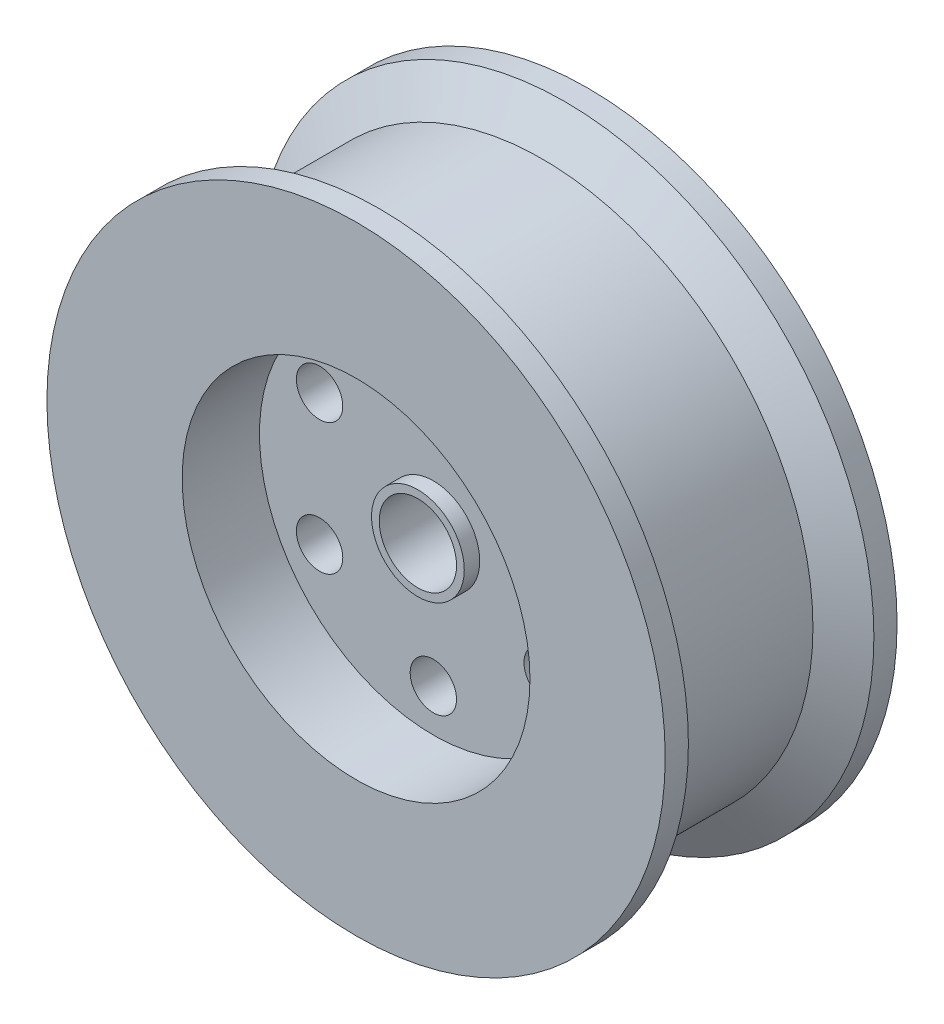
ISO-10303-21;
HEADER;
FILE_DESCRIPTION(('STEP AP214'),'2;1');
FILE_NAME('part.step','',(''),(''),'','','');
FILE_SCHEMA(('AUTOMOTIVE_DESIGN { 1 0 10303 214 1 1 1 1 }'));
ENDSEC;
DATA;
#1=APPLICATION_CONTEXT('core data for automotive mechanical design processes');
#2=APPLICATION_PROTOCOL_DEFINITION('international standard','automotive_design',2000,#1);
#3=PRODUCT_CONTEXT('',#1,'mechanical');
#4=PRODUCT('Part','Part','',(#3));
#5=PRODUCT_RELATED_PRODUCT_CATEGORY('part','',(#4));
#6=PRODUCT_DEFINITION_FORMATION('','',#4);
#7=PRODUCT_DEFINITION_CONTEXT('part definition',#1,'design');
#8=PRODUCT_DEFINITION('design','',#6,#7);
#9=PRODUCT_DEFINITION_SHAPE('','',#8);
#10=(LENGTH_UNIT() NAMED_UNIT(*) SI_UNIT(.MILLI.,.METRE.));
#11=(NAMED_UNIT(*) PLANE_ANGLE_UNIT() SI_UNIT($,.RADIAN.));
#12=(NAMED_UNIT(*) SI_UNIT($,.STERADIAN.) SOLID_ANGLE_UNIT());
#13=UNCERTAINTY_MEASURE_WITH_UNIT(LENGTH_MEASURE(1.E-05),#10,'distance_accuracy_value','');
#14=(GEOMETRIC_REPRESENTATION_CONTEXT(3) GLOBAL_UNCERTAINTY_ASSIGNED_CONTEXT((#13)) GLOBAL_UNIT_ASSIGNED_CONTEXT((#10,
#11,#12)) REPRESENTATION_CONTEXT('',''));
#15=CARTESIAN_POINT('',(0.,0.,0.));
#16=DIRECTION('',(0.,0.,1.));
#17=DIRECTION('',(1.,0.,0.));
#18=AXIS2_PLACEMENT_3D('',#15,#16,#17);
#19=CARTESIAN_POINT('',(0.,0.,15.));
#20=DIRECTION('',(0.,0.,-1.));
#21=DIRECTION('',(-1.,0.,0.));
#22=AXIS2_PLACEMENT_3D('',#19,#20,#21);
#23=CYLINDRICAL_SURFACE('',#22,40.);
#24=CARTESIAN_POINT('',(0.,0.,-12.));
#25=DIRECTION('',(0.,0.,1.));
#26=DIRECTION('',(1.,0.,0.));
#27=AXIS2_PLACEMENT_3D('',#24,#25,#26);
#28=CIRCLE('',#27,40.);
#29=CARTESIAN_POINT('',(40.,0.,-12.));
#30=VERTEX_POINT('',#29);
#31=EDGE_CURVE('E152',#30,#30,#28,.T.);
#32=ORIENTED_EDGE('',*,*,#31,.F.);
#33=EDGE_LOOP('',(#32));
#34=FACE_BOUND('',#33,.T.);
#35=CARTESIAN_POINT('',(0.,0.,-15.));
#36=DIRECTION('',(0.,0.,1.));
#37=DIRECTION('',(1.,0.,0.));
#38=AXIS2_PLACEMENT_3D('',#35,#36,#37);
#39=CIRCLE('',#38,40.);
#40=CARTESIAN_POINT('',(40.,0.,-15.));
#41=VERTEX_POINT('',#40);
#42=EDGE_CURVE('E68',#41,#41,#39,.T.);
#43=ORIENTED_EDGE('',*,*,#42,.T.);
#44=EDGE_LOOP('',(#43));
#45=FACE_BOUND('',#44,.T.);
#46=ADVANCED_FACE('F55',(#34,#45),#23,.T.);
#47=CARTESIAN_POINT('',(0.,0.,15.));
#48=DIRECTION('',(0.,0.,-1.));
#49=DIRECTION('',(-1.,0.,0.));
#50=AXIS2_PLACEMENT_3D('',#47,#48,#49);
#51=CYLINDRICAL_SURFACE('',#50,5.);
#52=CARTESIAN_POINT('',(0.,0.,7.));
#53=DIRECTION('',(0.,0.,1.));
#54=DIRECTION('',(1.,0.,0.));
#55=AXIS2_PLACEMENT_3D('',#52,#53,#54);
#56=CIRCLE('',#55,5.);
#57=CARTESIAN_POINT('',(5.,0.,7.));
#58=VERTEX_POINT('',#57);
#59=EDGE_CURVE('E156',#58,#58,#56,.T.);
#60=ORIENTED_EDGE('',*,*,#59,.T.);
#61=EDGE_LOOP('',(#60));
#62=FACE_BOUND('',#61,.T.);
#63=CARTESIAN_POINT('',(0.,0.,-5.));
#64=DIRECTION('',(0.,0.,-1.));
#65=DIRECTION('',(-1.,0.,0.));
#66=AXIS2_PLACEMENT_3D('',#63,#64,#65);
#67=CIRCLE('',#66,5.);
#68=CARTESIAN_POINT('',(-5.,0.,-5.));
#69=VERTEX_POINT('',#68);
#70=EDGE_CURVE('E79',#69,#69,#67,.T.);
#71=ORIENTED_EDGE('',*,*,#70,.T.);
#72=EDGE_LOOP('',(#71));
#73=FACE_BOUND('',#72,.T.);
#74=ADVANCED_FACE('F115',(#62,#73),#51,.F.);
#75=CARTESIAN_POINT('',(0.,0.,15.));
#76=DIRECTION('',(0.,0.,1.));
#77=DIRECTION('',(1.,0.,0.));
#78=AXIS2_PLACEMENT_3D('',#75,#76,#77);
#79=PLANE('',#78);
#80=CARTESIAN_POINT('',(0.,0.,15.));
#81=DIRECTION('',(0.,0.,1.));
#82=DIRECTION('',(1.,0.,0.));
#83=AXIS2_PLACEMENT_3D('',#80,#81,#82);
#84=CIRCLE('',#83,22.5);
#85=CARTESIAN_POINT('',(22.5,0.,15.));
#86=VERTEX_POINT('',#85);
#87=EDGE_CURVE('E77',#86,#86,#84,.T.);
#88=ORIENTED_EDGE('',*,*,#87,.F.);
#89=EDGE_LOOP('',(#88));
#90=FACE_BOUND('',#89,.T.);
#91=CARTESIAN_POINT('',(0.,0.,15.));
#92=DIRECTION('',(0.,0.,1.));
#93=DIRECTION('',(1.,0.,0.));
#94=AXIS2_PLACEMENT_3D('',#91,#92,#93);
#95=CIRCLE('',#94,40.);
#96=CARTESIAN_POINT('',(40.,0.,15.));
#97=VERTEX_POINT('',#96);
#98=EDGE_CURVE('E63',#97,#97,#95,.T.);
#99=ORIENTED_EDGE('',*,*,#98,.T.);
#100=EDGE_LOOP('',(#99));
#101=FACE_BOUND('',#100,.T.);
#102=ADVANCED_FACE('F112',(#90,#101),#79,.T.);
#103=CARTESIAN_POINT('',(0.,0.,-15.));
#104=DIRECTION('',(0.,0.,1.));
#105=DIRECTION('',(1.,0.,0.));
#106=AXIS2_PLACEMENT_3D('',#103,#104,#105);
#107=PLANE('',#106);
#108=CARTESIAN_POINT('',(0.,0.,-15.));
#109=DIRECTION('',(0.,0.,1.));
#110=DIRECTION('',(1.,0.,0.));
#111=AXIS2_PLACEMENT_3D('',#108,#109,#110);
#112=CIRCLE('',#111,22.5);
#113=CARTESIAN_POINT('',(22.5,0.,-15.));
#114=VERTEX_POINT('',#113);
#115=EDGE_CURVE('E89',#114,#114,#112,.T.);
#116=ORIENTED_EDGE('',*,*,#115,.T.);
#117=EDGE_LOOP('',(#116));
#118=FACE_BOUND('',#117,.T.);
#119=ORIENTED_EDGE('',*,*,#42,.F.);
#120=EDGE_LOOP('',(#119));
#121=FACE_BOUND('',#120,.T.);
#122=ADVANCED_FACE('F114',(#118,#121),#107,.F.);
#123=CARTESIAN_POINT('',(0.,0.,12.));
#124=DIRECTION('',(0.,0.,1.));
#125=DIRECTION('',(1.,0.,0.));
#126=AXIS2_PLACEMENT_3D('',#123,#124,#125);
#127=CIRCLE('',#126,40.);
#128=CARTESIAN_POINT('',(40.,0.,12.));
#129=VERTEX_POINT('',#128);
#130=EDGE_CURVE('E139',#129,#129,#127,.T.);
#131=ORIENTED_EDGE('',*,*,#130,.T.);
#132=EDGE_LOOP('',(#131));
#133=FACE_BOUND('',#132,.T.);
#134=ORIENTED_EDGE('',*,*,#98,.F.);
#135=EDGE_LOOP('',(#134));
#136=FACE_BOUND('',#135,.T.);
#137=ADVANCED_FACE('F57',(#133,#136),#23,.T.);
#138=CARTESIAN_POINT('',(0.,0.,5.));
#139=DIRECTION('',(0.,0.,1.));
#140=DIRECTION('',(1.,0.,0.));
#141=AXIS2_PLACEMENT_3D('',#138,#139,#140);
#142=CYLINDRICAL_SURFACE('',#141,22.5);
#143=CARTESIAN_POINT('',(0.,0.,5.));
#144=DIRECTION('',(0.,0.,1.));
#145=DIRECTION('',(1.,0.,0.));
#146=AXIS2_PLACEMENT_3D('',#143,#144,#145);
#147=CIRCLE('',#146,22.5);
#148=CARTESIAN_POINT('',(22.5,0.,5.));
#149=VERTEX_POINT('',#148);
#150=EDGE_CURVE('E74',#149,#149,#147,.T.);
#151=ORIENTED_EDGE('',*,*,#150,.F.);
#152=EDGE_LOOP('',(#151));
#153=FACE_BOUND('',#152,.T.);
#154=ORIENTED_EDGE('',*,*,#87,.T.);
#155=EDGE_LOOP('',(#154));
#156=FACE_BOUND('',#155,.T.);
#157=ADVANCED_FACE('F106',(#153,#156),#142,.F.);
#158=CARTESIAN_POINT('',(0.,0.,5.));
#159=DIRECTION('',(0.,0.,1.));
#160=DIRECTION('',(1.,0.,0.));
#161=AXIS2_PLACEMENT_3D('',#158,#159,#160);
#162=PLANE('',#161);
#163=CARTESIAN_POINT('',(0.,0.,5.));
#164=DIRECTION('',(0.,0.,1.));
#165=DIRECTION('',(1.,0.,0.));
#166=AXIS2_PLACEMENT_3D('',#163,#164,#165);
#167=CIRCLE('',#166,6.);
#168=CARTESIAN_POINT('',(6.,0.,5.));
#169=VERTEX_POINT('',#168);
#170=EDGE_CURVE('E11',#169,#169,#167,.T.);
#171=ORIENTED_EDGE('',*,*,#170,.F.);
#172=EDGE_LOOP('',(#171));
#173=FACE_BOUND('',#172,.T.);
#174=CARTESIAN_POINT('',(-14.7224318643354,8.50000000000017,5.));
#175=DIRECTION('',(0.,0.,1.));
#176=DIRECTION('',(0.50000000000001,0.866025403784433,0.));
#177=AXIS2_PLACEMENT_3D('',#174,#175,#176);
#178=CIRCLE('',#177,3.);
#179=CARTESIAN_POINT('',(-13.2224318643353,11.0980762113535,5.));
#180=VERTEX_POINT('',#179);
#181=EDGE_CURVE('E164',#180,#180,#178,.T.);
#182=ORIENTED_EDGE('',*,*,#181,.F.);
#183=EDGE_LOOP('',(#182));
#184=FACE_BOUND('',#183,.T.);
#185=CARTESIAN_POINT('',(-14.7224318643355,-8.49999999999986,5.));
#186=DIRECTION('',(0.,0.,1.));
#187=DIRECTION('',(-0.499999999999992,0.866025403784443,0.));
#188=AXIS2_PLACEMENT_3D('',#185,#186,#187);
#189=CIRCLE('',#188,3.);
#190=CARTESIAN_POINT('',(-16.2224318643355,-5.90192378864653,5.));
#191=VERTEX_POINT('',#190);
#192=EDGE_CURVE('E169',#191,#191,#189,.T.);
#193=ORIENTED_EDGE('',*,*,#192,.F.);
#194=EDGE_LOOP('',(#193));
#195=FACE_BOUND('',#194,.T.);
#196=CARTESIAN_POINT('',(0.,-17.,5.));
#197=DIRECTION('',(0.,0.,1.));
#198=DIRECTION('',(-1.,0.,0.));
#199=AXIS2_PLACEMENT_3D('',#196,#197,#198);
#200=CIRCLE('',#199,3.);
#201=CARTESIAN_POINT('',(-3.,-17.,5.));
#202=VERTEX_POINT('',#201);
#203=EDGE_CURVE('E177',#202,#202,#200,.T.);
#204=ORIENTED_EDGE('',*,*,#203,.F.);
#205=EDGE_LOOP('',(#204));
#206=FACE_BOUND('',#205,.T.);
#207=CARTESIAN_POINT('',(14.7224318643354,-8.50000000000007,5.));
#208=DIRECTION('',(0.,0.,1.));
#209=DIRECTION('',(-0.500000000000004,-0.866025403784436,0.));
#210=AXIS2_PLACEMENT_3D('',#207,#208,#209);
#211=CIRCLE('',#210,3.);
#212=CARTESIAN_POINT('',(13.2224318643354,-11.0980762113534,5.));
#213=VERTEX_POINT('',#212);
#214=EDGE_CURVE('E185',#213,#213,#211,.T.);
#215=ORIENTED_EDGE('',*,*,#214,.F.);
#216=EDGE_LOOP('',(#215));
#217=FACE_BOUND('',#216,.T.);
#218=CARTESIAN_POINT('',(14.7224318643355,8.49999999999997,5.));
#219=DIRECTION('',(0.,0.,1.));
#220=DIRECTION('',(0.499999999999998,-0.86602540378444,0.));
#221=AXIS2_PLACEMENT_3D('',#218,#219,#220);
#222=CIRCLE('',#221,3.);
#223=CARTESIAN_POINT('',(16.2224318643355,5.90192378864665,5.));
#224=VERTEX_POINT('',#223);
#225=EDGE_CURVE('E193',#224,#224,#222,.T.);
#226=ORIENTED_EDGE('',*,*,#225,.F.);
#227=EDGE_LOOP('',(#226));
#228=FACE_BOUND('',#227,.T.);
#229=CARTESIAN_POINT('',(0.,17.,5.));
#230=DIRECTION('',(0.,0.,1.));
#231=DIRECTION('',(1.,0.,0.));
#232=AXIS2_PLACEMENT_3D('',#229,#230,#231);
#233=CIRCLE('',#232,3.);
#234=CARTESIAN_POINT('',(3.,17.,5.));
#235=VERTEX_POINT('',#234);
#236=EDGE_CURVE('E98',#235,#235,#233,.T.);
#237=ORIENTED_EDGE('',*,*,#236,.F.);
#238=EDGE_LOOP('',(#237));
#239=FACE_BOUND('',#238,.T.);
#240=ORIENTED_EDGE('',*,*,#150,.T.);
#241=EDGE_LOOP('',(#240));
#242=FACE_BOUND('',#241,.T.);
#243=ADVANCED_FACE('F104',(#173,#184,#195,#206,#217,#228,#239,#242),#162,.T.);
#244=CARTESIAN_POINT('',(0.,0.,-5.));
#245=DIRECTION('',(0.,0.,-1.));
#246=DIRECTION('',(-1.,0.,0.));
#247=AXIS2_PLACEMENT_3D('',#244,#245,#246);
#248=CYLINDRICAL_SURFACE('',#247,22.5);
#249=CARTESIAN_POINT('',(0.,0.,-5.));
#250=DIRECTION('',(0.,0.,1.));
#251=DIRECTION('',(1.,0.,0.));
#252=AXIS2_PLACEMENT_3D('',#249,#250,#251);
#253=CIRCLE('',#252,22.5);
#254=CARTESIAN_POINT('',(22.5,0.,-5.));
#255=VERTEX_POINT('',#254);
#256=EDGE_CURVE('E82',#255,#255,#253,.T.);
#257=ORIENTED_EDGE('',*,*,#256,.T.);
#258=EDGE_LOOP('',(#257));
#259=FACE_BOUND('',#258,.T.);
#260=ORIENTED_EDGE('',*,*,#115,.F.);
#261=EDGE_LOOP('',(#260));
#262=FACE_BOUND('',#261,.T.);
#263=ADVANCED_FACE('F214',(#259,#262),#248,.F.);
#264=CARTESIAN_POINT('',(0.,0.,-5.));
#265=DIRECTION('',(0.,0.,-1.));
#266=DIRECTION('',(1.,0.,0.));
#267=AXIS2_PLACEMENT_3D('',#264,#265,#266);
#268=PLANE('',#267);
#269=CARTESIAN_POINT('',(-14.7224318643354,8.50000000000017,-5.));
#270=DIRECTION('',(0.,0.,1.));
#271=DIRECTION('',(0.50000000000001,0.866025403784433,0.));
#272=AXIS2_PLACEMENT_3D('',#269,#270,#271);
#273=CIRCLE('',#272,3.);
#274=CARTESIAN_POINT('',(-13.2224318643353,11.0980762113535,-5.));
#275=VERTEX_POINT('',#274);
#276=EDGE_CURVE('E165',#275,#275,#273,.T.);
#277=ORIENTED_EDGE('',*,*,#276,.T.);
#278=EDGE_LOOP('',(#277));
#279=FACE_BOUND('',#278,.T.);
#280=CARTESIAN_POINT('',(-14.7224318643355,-8.49999999999986,-5.));
#281=DIRECTION('',(0.,0.,1.));
#282=DIRECTION('',(-0.499999999999992,0.866025403784443,0.));
#283=AXIS2_PLACEMENT_3D('',#280,#281,#282);
#284=CIRCLE('',#283,3.);
#285=CARTESIAN_POINT('',(-16.2224318643355,-5.90192378864653,-5.));
#286=VERTEX_POINT('',#285);
#287=EDGE_CURVE('E173',#286,#286,#284,.T.);
#288=ORIENTED_EDGE('',*,*,#287,.T.);
#289=EDGE_LOOP('',(#288));
#290=FACE_BOUND('',#289,.T.);
#291=CARTESIAN_POINT('',(0.,-17.,-5.));
#292=DIRECTION('',(0.,0.,1.));
#293=DIRECTION('',(-1.,0.,0.));
#294=AXIS2_PLACEMENT_3D('',#291,#292,#293);
#295=CIRCLE('',#294,3.);
#296=CARTESIAN_POINT('',(-3.,-17.,-5.));
#297=VERTEX_POINT('',#296);
#298=EDGE_CURVE('E181',#297,#297,#295,.T.);
#299=ORIENTED_EDGE('',*,*,#298,.T.);
#300=EDGE_LOOP('',(#299));
#301=FACE_BOUND('',#300,.T.);
#302=CARTESIAN_POINT('',(14.7224318643354,-8.50000000000007,-5.));
#303=DIRECTION('',(0.,0.,1.));
#304=DIRECTION('',(-0.500000000000004,-0.866025403784436,0.));
#305=AXIS2_PLACEMENT_3D('',#302,#303,#304);
#306=CIRCLE('',#305,3.);
#307=CARTESIAN_POINT('',(13.2224318643354,-11.0980762113534,-5.));
#308=VERTEX_POINT('',#307);
#309=EDGE_CURVE('E189',#308,#308,#306,.T.);
#310=ORIENTED_EDGE('',*,*,#309,.T.);
#311=EDGE_LOOP('',(#310));
#312=FACE_BOUND('',#311,.T.);
#313=CARTESIAN_POINT('',(14.7224318643355,8.49999999999997,-5.));
#314=DIRECTION('',(0.,0.,1.));
#315=DIRECTION('',(0.499999999999998,-0.86602540378444,0.));
#316=AXIS2_PLACEMENT_3D('',#313,#314,#315);
#317=CIRCLE('',#316,3.);
#318=CARTESIAN_POINT('',(16.2224318643355,5.90192378864665,-5.));
#319=VERTEX_POINT('',#318);
#320=EDGE_CURVE('E197',#319,#319,#317,.T.);
#321=ORIENTED_EDGE('',*,*,#320,.T.);
#322=EDGE_LOOP('',(#321));
#323=FACE_BOUND('',#322,.T.);
#324=CARTESIAN_POINT('',(0.,17.,-5.));
#325=DIRECTION('',(0.,0.,1.));
#326=DIRECTION('',(1.,0.,0.));
#327=AXIS2_PLACEMENT_3D('',#324,#325,#326);
#328=CIRCLE('',#327,3.);
#329=CARTESIAN_POINT('',(3.,17.,-5.));
#330=VERTEX_POINT('',#329);
#331=EDGE_CURVE('E95',#330,#330,#328,.T.);
#332=ORIENTED_EDGE('',*,*,#331,.T.);
#333=EDGE_LOOP('',(#332));
#334=FACE_BOUND('',#333,.T.);
#335=ORIENTED_EDGE('',*,*,#70,.F.);
#336=EDGE_LOOP('',(#335));
#337=FACE_BOUND('',#336,.T.);
#338=ORIENTED_EDGE('',*,*,#256,.F.);
#339=EDGE_LOOP('',(#338));
#340=FACE_BOUND('',#339,.T.);
#341=ADVANCED_FACE('F221',(#279,#290,#301,#312,#323,#334,#337,#340),#268,.T.);
#342=CARTESIAN_POINT('',(0.,17.,-5.));
#343=DIRECTION('',(0.,0.,1.));
#344=DIRECTION('',(1.,0.,0.));
#345=AXIS2_PLACEMENT_3D('',#342,#343,#344);
#346=CYLINDRICAL_SURFACE('',#345,3.);
#347=ORIENTED_EDGE('',*,*,#331,.F.);
#348=EDGE_LOOP('',(#347));
#349=FACE_BOUND('',#348,.T.);
#350=ORIENTED_EDGE('',*,*,#236,.T.);
#351=EDGE_LOOP('',(#350));
#352=FACE_BOUND('',#351,.T.);
#353=ADVANCED_FACE('F211',(#349,#352),#346,.F.);
#354=CARTESIAN_POINT('',(14.7224318643355,8.49999999999997,-5.));
#355=DIRECTION('',(0.,0.,1.));
#356=DIRECTION('',(1.,0.,0.));
#357=AXIS2_PLACEMENT_3D('',#354,#355,#356);
#358=CYLINDRICAL_SURFACE('',#357,3.);
#359=ORIENTED_EDGE('',*,*,#320,.F.);
#360=EDGE_LOOP('',(#359));
#361=FACE_BOUND('',#360,.T.);
#362=ORIENTED_EDGE('',*,*,#225,.T.);
#363=EDGE_LOOP('',(#362));
#364=FACE_BOUND('',#363,.T.);
#365=ADVANCED_FACE('F230',(#361,#364),#358,.F.);
#366=CARTESIAN_POINT('',(14.7224318643354,-8.50000000000007,-5.));
#367=DIRECTION('',(0.,0.,1.));
#368=DIRECTION('',(1.,0.,0.));
#369=AXIS2_PLACEMENT_3D('',#366,#367,#368);
#370=CYLINDRICAL_SURFACE('',#369,3.);
#371=ORIENTED_EDGE('',*,*,#309,.F.);
#372=EDGE_LOOP('',(#371));
#373=FACE_BOUND('',#372,.T.);
#374=ORIENTED_EDGE('',*,*,#214,.T.);
#375=EDGE_LOOP('',(#374));
#376=FACE_BOUND('',#375,.T.);
#377=ADVANCED_FACE('F234',(#373,#376),#370,.F.);
#378=CARTESIAN_POINT('',(0.,-17.,-5.));
#379=DIRECTION('',(0.,0.,1.));
#380=DIRECTION('',(1.,0.,0.));
#381=AXIS2_PLACEMENT_3D('',#378,#379,#380);
#382=CYLINDRICAL_SURFACE('',#381,3.);
#383=ORIENTED_EDGE('',*,*,#298,.F.);
#384=EDGE_LOOP('',(#383));
#385=FACE_BOUND('',#384,.T.);
#386=ORIENTED_EDGE('',*,*,#203,.T.);
#387=EDGE_LOOP('',(#386));
#388=FACE_BOUND('',#387,.T.);
#389=ADVANCED_FACE('F238',(#385,#388),#382,.F.);
#390=CARTESIAN_POINT('',(-14.7224318643355,-8.49999999999986,-5.));
#391=DIRECTION('',(0.,0.,1.));
#392=DIRECTION('',(1.,0.,0.));
#393=AXIS2_PLACEMENT_3D('',#390,#391,#392);
#394=CYLINDRICAL_SURFACE('',#393,3.);
#395=ORIENTED_EDGE('',*,*,#287,.F.);
#396=EDGE_LOOP('',(#395));
#397=FACE_BOUND('',#396,.T.);
#398=ORIENTED_EDGE('',*,*,#192,.T.);
#399=EDGE_LOOP('',(#398));
#400=FACE_BOUND('',#399,.T.);
#401=ADVANCED_FACE('F242',(#397,#400),#394,.F.);
#402=CARTESIAN_POINT('',(-14.7224318643354,8.50000000000017,-5.));
#403=DIRECTION('',(0.,0.,1.));
#404=DIRECTION('',(1.,0.,0.));
#405=AXIS2_PLACEMENT_3D('',#402,#403,#404);
#406=CYLINDRICAL_SURFACE('',#405,3.);
#407=ORIENTED_EDGE('',*,*,#276,.F.);
#408=EDGE_LOOP('',(#407));
#409=FACE_BOUND('',#408,.T.);
#410=ORIENTED_EDGE('',*,*,#181,.T.);
#411=EDGE_LOOP('',(#410));
#412=FACE_BOUND('',#411,.T.);
#413=ADVANCED_FACE('F246',(#409,#412),#406,.F.);
#414=CARTESIAN_POINT('',(0.,0.,-2.));
#415=DIRECTION('',(0.,0.,1.));
#416=DIRECTION('',(1.,0.,0.));
#417=AXIS2_PLACEMENT_3D('',#414,#415,#416);
#418=CYLINDRICAL_SURFACE('',#417,6.);
#419=ORIENTED_EDGE('',*,*,#170,.T.);
#420=EDGE_LOOP('',(#419));
#421=FACE_BOUND('',#420,.T.);
#422=CARTESIAN_POINT('',(0.,0.,7.));
#423=DIRECTION('',(0.,0.,1.));
#424=DIRECTION('',(1.,0.,0.));
#425=AXIS2_PLACEMENT_3D('',#422,#423,#424);
#426=CIRCLE('',#425,6.);
#427=CARTESIAN_POINT('',(6.,0.,7.));
#428=VERTEX_POINT('',#427);
#429=EDGE_CURVE('E160',#428,#428,#426,.T.);
#430=ORIENTED_EDGE('',*,*,#429,.F.);
#431=EDGE_LOOP('',(#430));
#432=FACE_BOUND('',#431,.T.);
#433=ADVANCED_FACE('F250',(#421,#432),#418,.T.);
#434=CARTESIAN_POINT('',(0.,0.,7.));
#435=DIRECTION('',(0.,0.,1.));
#436=DIRECTION('',(1.,0.,0.));
#437=AXIS2_PLACEMENT_3D('',#434,#435,#436);
#438=PLANE('',#437);
#439=ORIENTED_EDGE('',*,*,#429,.T.);
#440=EDGE_LOOP('',(#439));
#441=FACE_BOUND('',#440,.T.);
#442=ORIENTED_EDGE('',*,*,#59,.F.);
#443=EDGE_LOOP('',(#442));
#444=FACE_BOUND('',#443,.T.);
#445=ADVANCED_FACE('F253',(#441,#444),#438,.T.);
#446=CARTESIAN_POINT('',(0.,0.,-12.));
#447=DIRECTION('',(0.,0.,-1.));
#448=DIRECTION('',(-1.,0.,0.));
#449=AXIS2_PLACEMENT_3D('',#446,#447,#448);
#450=CONICAL_SURFACE('',#449,40.,1.04719755119659);
#451=CARTESIAN_POINT('',(0.,0.,-9.11324865405184));
#452=DIRECTION('',(0.,0.,1.));
#453=DIRECTION('',(1.,0.,0.));
#454=AXIS2_PLACEMENT_3D('',#451,#452,#453);
#455=CIRCLE('',#454,35.);
#456=CARTESIAN_POINT('',(35.,0.,-9.11324865405184));
#457=VERTEX_POINT('',#456);
#458=EDGE_CURVE('E146',#457,#457,#455,.T.);
#459=ORIENTED_EDGE('',*,*,#458,.F.);
#460=EDGE_LOOP('',(#459));
#461=FACE_BOUND('',#460,.T.);
#462=ORIENTED_EDGE('',*,*,#31,.T.);
#463=EDGE_LOOP('',(#462));
#464=FACE_BOUND('',#463,.T.);
#465=ADVANCED_FACE('F255',(#461,#464),#450,.T.);
#466=CARTESIAN_POINT('',(0.,0.,0.));
#467=DIRECTION('',(0.,0.,1.));
#468=DIRECTION('',(1.,0.,0.));
#469=AXIS2_PLACEMENT_3D('',#466,#467,#468);
#470=CYLINDRICAL_SURFACE('',#469,35.);
#471=CARTESIAN_POINT('',(0.,0.,9.11324865405184));
#472=DIRECTION('',(0.,0.,1.));
#473=DIRECTION('',(1.,0.,0.));
#474=AXIS2_PLACEMENT_3D('',#471,#472,#473);
#475=CIRCLE('',#474,35.);
#476=CARTESIAN_POINT('',(35.,0.,9.11324865405184));
#477=VERTEX_POINT('',#476);
#478=EDGE_CURVE('E142',#477,#477,#475,.T.);
#479=ORIENTED_EDGE('',*,*,#478,.F.);
#480=EDGE_LOOP('',(#479));
#481=FACE_BOUND('',#480,.T.);
#482=ORIENTED_EDGE('',*,*,#458,.T.);
#483=EDGE_LOOP('',(#482));
#484=FACE_BOUND('',#483,.T.);
#485=ADVANCED_FACE('F258',(#481,#484),#470,.T.);
#486=CARTESIAN_POINT('',(0.,0.,9.11324865405184));
#487=DIRECTION('',(0.,0.,1.));
#488=DIRECTION('',(1.,0.,0.));
#489=AXIS2_PLACEMENT_3D('',#486,#487,#488);
#490=CONICAL_SURFACE('',#489,35.,1.04719755119659);
#491=ORIENTED_EDGE('',*,*,#130,.F.);
#492=EDGE_LOOP('',(#491));
#493=FACE_BOUND('',#492,.T.);
#494=ORIENTED_EDGE('',*,*,#478,.T.);
#495=EDGE_LOOP('',(#494));
#496=FACE_BOUND('',#495,.T.);
#497=ADVANCED_FACE('F262',(#493,#496),#490,.T.);
#498=CLOSED_SHELL('',(#46,#74,#102,#122,#137,#157,#243,#263,#341,#353,#365,#377,#389,#401,#413,
#433,#445,#465,#485,#497));
#499=MANIFOLD_SOLID_BREP('B2',#498);
#500=ADVANCED_BREP_SHAPE_REPRESENTATION('',(#18,#499),#14);
#501=SHAPE_DEFINITION_REPRESENTATION(#9,#500);
ENDSEC;
END-ISO-10303-21;
